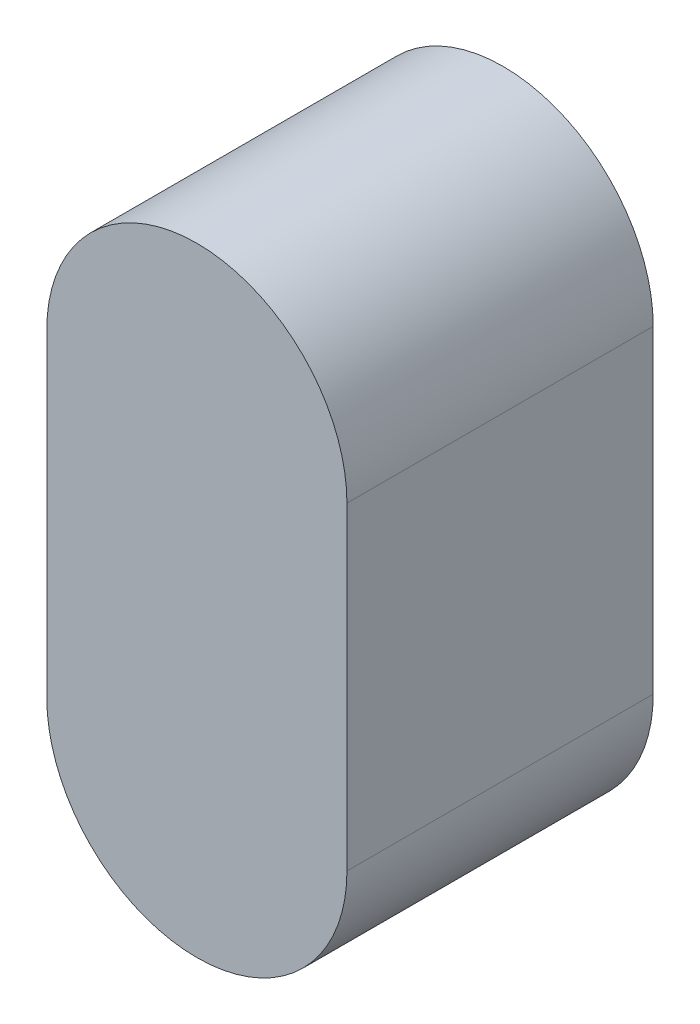
ISO-10303-21;
HEADER;
FILE_DESCRIPTION(('STEP AP214'),'2;1');
FILE_NAME('part.step','',(''),(''),'','','');
FILE_SCHEMA(('AUTOMOTIVE_DESIGN { 1 0 10303 214 1 1 1 1 }'));
ENDSEC;
DATA;
#1=APPLICATION_CONTEXT('core data for automotive mechanical design processes');
#2=APPLICATION_PROTOCOL_DEFINITION('international standard','automotive_design',2000,#1);
#3=PRODUCT_CONTEXT('',#1,'mechanical');
#4=PRODUCT('Part','Part','',(#3));
#5=PRODUCT_RELATED_PRODUCT_CATEGORY('part','',(#4));
#6=PRODUCT_DEFINITION_FORMATION('','',#4);
#7=PRODUCT_DEFINITION_CONTEXT('part definition',#1,'design');
#8=PRODUCT_DEFINITION('design','',#6,#7);
#9=PRODUCT_DEFINITION_SHAPE('','',#8);
#10=(LENGTH_UNIT() NAMED_UNIT(*) SI_UNIT(.MILLI.,.METRE.));
#11=(NAMED_UNIT(*) PLANE_ANGLE_UNIT() SI_UNIT($,.RADIAN.));
#12=(NAMED_UNIT(*) SI_UNIT($,.STERADIAN.) SOLID_ANGLE_UNIT());
#13=UNCERTAINTY_MEASURE_WITH_UNIT(LENGTH_MEASURE(1.E-05),#10,'distance_accuracy_value','');
#14=(GEOMETRIC_REPRESENTATION_CONTEXT(3) GLOBAL_UNCERTAINTY_ASSIGNED_CONTEXT((#13)) GLOBAL_UNIT_ASSIGNED_CONTEXT((#10,
#11,#12)) REPRESENTATION_CONTEXT('',''));
#15=CARTESIAN_POINT('',(0.,0.,0.));
#16=DIRECTION('',(0.,0.,1.));
#17=DIRECTION('',(1.,0.,0.));
#18=AXIS2_PLACEMENT_3D('',#15,#16,#17);
#19=CARTESIAN_POINT('',(0.,4.9,10.));
#20=DIRECTION('',(0.,0.,-1.));
#21=DIRECTION('',(-1.,0.,0.));
#22=AXIS2_PLACEMENT_3D('',#19,#20,#21);
#23=CYLINDRICAL_SURFACE('',#22,4.9);
#24=CARTESIAN_POINT('',(0.,4.9,0.));
#25=DIRECTION('',(0.,0.,1.));
#26=DIRECTION('',(1.,0.,0.));
#27=AXIS2_PLACEMENT_3D('',#24,#25,#26);
#28=CIRCLE('',#27,4.9);
#29=CARTESIAN_POINT('',(-4.9,4.9,0.));
#30=VERTEX_POINT('',#29);
#31=CARTESIAN_POINT('',(4.9,4.9,0.));
#32=VERTEX_POINT('',#31);
#33=EDGE_CURVE('E107',#30,#32,#28,.T.);
#34=ORIENTED_EDGE('',*,*,#33,.T.);
#35=DIRECTION('',(0.,0.,-1.));
#36=VECTOR('',#35,1.);
#37=CARTESIAN_POINT('',(4.9,4.9,10.));
#38=LINE('',#37,#36);
#39=CARTESIAN_POINT('',(4.9,4.9,10.));
#40=VERTEX_POINT('',#39);
#41=EDGE_CURVE('E11',#40,#32,#38,.T.);
#42=ORIENTED_EDGE('',*,*,#41,.F.);
#43=CARTESIAN_POINT('',(0.,4.9,10.));
#44=DIRECTION('',(0.,0.,1.));
#45=DIRECTION('',(1.,0.,0.));
#46=AXIS2_PLACEMENT_3D('',#43,#44,#45);
#47=CIRCLE('',#46,4.9);
#48=CARTESIAN_POINT('',(-4.9,4.9,10.));
#49=VERTEX_POINT('',#48);
#50=EDGE_CURVE('E91',#49,#40,#47,.T.);
#51=ORIENTED_EDGE('',*,*,#50,.F.);
#52=DIRECTION('',(0.,0.,-1.));
#53=VECTOR('',#52,1.);
#54=CARTESIAN_POINT('',(-4.9,4.9,10.));
#55=LINE('',#54,#53);
#56=EDGE_CURVE('E103',#49,#30,#55,.T.);
#57=ORIENTED_EDGE('',*,*,#56,.T.);
#58=EDGE_LOOP('',(#34,#42,#51,#57));
#59=FACE_BOUND('',#58,.T.);
#60=ADVANCED_FACE('F39',(#59),#23,.T.);
#61=CARTESIAN_POINT('',(4.9,4.9,10.));
#62=DIRECTION('',(-1.,0.,0.));
#63=DIRECTION('',(0.,-1.,0.));
#64=AXIS2_PLACEMENT_3D('',#61,#62,#63);
#65=PLANE('',#64);
#66=DIRECTION('',(0.,1.,0.));
#67=VECTOR('',#66,1.);
#68=CARTESIAN_POINT('',(4.9,4.9,0.));
#69=LINE('',#68,#67);
#70=CARTESIAN_POINT('',(4.9,15.3,0.));
#71=VERTEX_POINT('',#70);
#72=EDGE_CURVE('E96',#32,#71,#69,.T.);
#73=ORIENTED_EDGE('',*,*,#72,.T.);
#74=DIRECTION('',(0.,0.,-1.));
#75=VECTOR('',#74,1.);
#76=CARTESIAN_POINT('',(4.9,15.3,10.));
#77=LINE('',#76,#75);
#78=CARTESIAN_POINT('',(4.9,15.3,10.));
#79=VERTEX_POINT('',#78);
#80=EDGE_CURVE('E48',#79,#71,#77,.T.);
#81=ORIENTED_EDGE('',*,*,#80,.F.);
#82=DIRECTION('',(0.,1.,0.));
#83=VECTOR('',#82,1.);
#84=CARTESIAN_POINT('',(4.9,4.9,10.));
#85=LINE('',#84,#83);
#86=EDGE_CURVE('E86',#40,#79,#85,.T.);
#87=ORIENTED_EDGE('',*,*,#86,.F.);
#88=ORIENTED_EDGE('',*,*,#41,.T.);
#89=EDGE_LOOP('',(#73,#81,#87,#88));
#90=FACE_BOUND('',#89,.T.);
#91=ADVANCED_FACE('F95',(#90),#65,.F.);
#92=CARTESIAN_POINT('',(0.,15.3,10.));
#93=DIRECTION('',(0.,0.,-1.));
#94=DIRECTION('',(-1.,0.,0.));
#95=AXIS2_PLACEMENT_3D('',#92,#93,#94);
#96=CYLINDRICAL_SURFACE('',#95,4.9);
#97=CARTESIAN_POINT('',(0.,15.3,0.));
#98=DIRECTION('',(0.,0.,1.));
#99=DIRECTION('',(1.,0.,0.));
#100=AXIS2_PLACEMENT_3D('',#97,#98,#99);
#101=CIRCLE('',#100,4.9);
#102=CARTESIAN_POINT('',(-4.9,15.3,0.));
#103=VERTEX_POINT('',#102);
#104=EDGE_CURVE('E73',#71,#103,#101,.T.);
#105=ORIENTED_EDGE('',*,*,#104,.T.);
#106=DIRECTION('',(0.,0.,-1.));
#107=VECTOR('',#106,1.);
#108=CARTESIAN_POINT('',(-4.9,15.3,10.));
#109=LINE('',#108,#107);
#110=CARTESIAN_POINT('',(-4.9,15.3,10.));
#111=VERTEX_POINT('',#110);
#112=EDGE_CURVE('E98',#111,#103,#109,.T.);
#113=ORIENTED_EDGE('',*,*,#112,.F.);
#114=CARTESIAN_POINT('',(0.,15.3,10.));
#115=DIRECTION('',(0.,0.,1.));
#116=DIRECTION('',(1.,0.,0.));
#117=AXIS2_PLACEMENT_3D('',#114,#115,#116);
#118=CIRCLE('',#117,4.9);
#119=EDGE_CURVE('E89',#79,#111,#118,.T.);
#120=ORIENTED_EDGE('',*,*,#119,.F.);
#121=ORIENTED_EDGE('',*,*,#80,.T.);
#122=EDGE_LOOP('',(#105,#113,#120,#121));
#123=FACE_BOUND('',#122,.T.);
#124=ADVANCED_FACE('F99',(#123),#96,.T.);
#125=CARTESIAN_POINT('',(-4.9,4.9,10.));
#126=DIRECTION('',(1.,0.,0.));
#127=DIRECTION('',(0.,1.,0.));
#128=AXIS2_PLACEMENT_3D('',#125,#126,#127);
#129=PLANE('',#128);
#130=DIRECTION('',(0.,-1.,0.));
#131=VECTOR('',#130,1.);
#132=CARTESIAN_POINT('',(-4.9,4.9,0.));
#133=LINE('',#132,#131);
#134=EDGE_CURVE('E79',#103,#30,#133,.T.);
#135=ORIENTED_EDGE('',*,*,#134,.T.);
#136=ORIENTED_EDGE('',*,*,#56,.F.);
#137=DIRECTION('',(0.,-1.,0.));
#138=VECTOR('',#137,1.);
#139=CARTESIAN_POINT('',(-4.9,4.9,10.));
#140=LINE('',#139,#138);
#141=EDGE_CURVE('E56',#111,#49,#140,.T.);
#142=ORIENTED_EDGE('',*,*,#141,.F.);
#143=ORIENTED_EDGE('',*,*,#112,.T.);
#144=EDGE_LOOP('',(#135,#136,#142,#143));
#145=FACE_BOUND('',#144,.T.);
#146=ADVANCED_FACE('F120',(#145),#129,.F.);
#147=CARTESIAN_POINT('',(0.,4.9,10.));
#148=DIRECTION('',(0.,0.,1.));
#149=DIRECTION('',(1.,0.,0.));
#150=AXIS2_PLACEMENT_3D('',#147,#148,#149);
#151=PLANE('',#150);
#152=ORIENTED_EDGE('',*,*,#50,.T.);
#153=ORIENTED_EDGE('',*,*,#86,.T.);
#154=ORIENTED_EDGE('',*,*,#119,.T.);
#155=ORIENTED_EDGE('',*,*,#141,.T.);
#156=EDGE_LOOP('',(#152,#153,#154,#155));
#157=FACE_BOUND('',#156,.T.);
#158=ADVANCED_FACE('F87',(#157),#151,.T.);
#159=CARTESIAN_POINT('',(0.,4.9,0.));
#160=DIRECTION('',(0.,0.,1.));
#161=DIRECTION('',(1.,0.,0.));
#162=AXIS2_PLACEMENT_3D('',#159,#160,#161);
#163=PLANE('',#162);
#164=ORIENTED_EDGE('',*,*,#33,.F.);
#165=ORIENTED_EDGE('',*,*,#134,.F.);
#166=ORIENTED_EDGE('',*,*,#104,.F.);
#167=ORIENTED_EDGE('',*,*,#72,.F.);
#168=EDGE_LOOP('',(#164,#165,#166,#167));
#169=FACE_BOUND('',#168,.T.);
#170=ADVANCED_FACE('F123',(#169),#163,.F.);
#171=CLOSED_SHELL('',(#60,#91,#124,#146,#158,#170));
#172=MANIFOLD_SOLID_BREP('B2',#171);
#173=ADVANCED_BREP_SHAPE_REPRESENTATION('',(#18,#172),#14);
#174=SHAPE_DEFINITION_REPRESENTATION(#9,#173);
ENDSEC;
END-ISO-10303-21;
